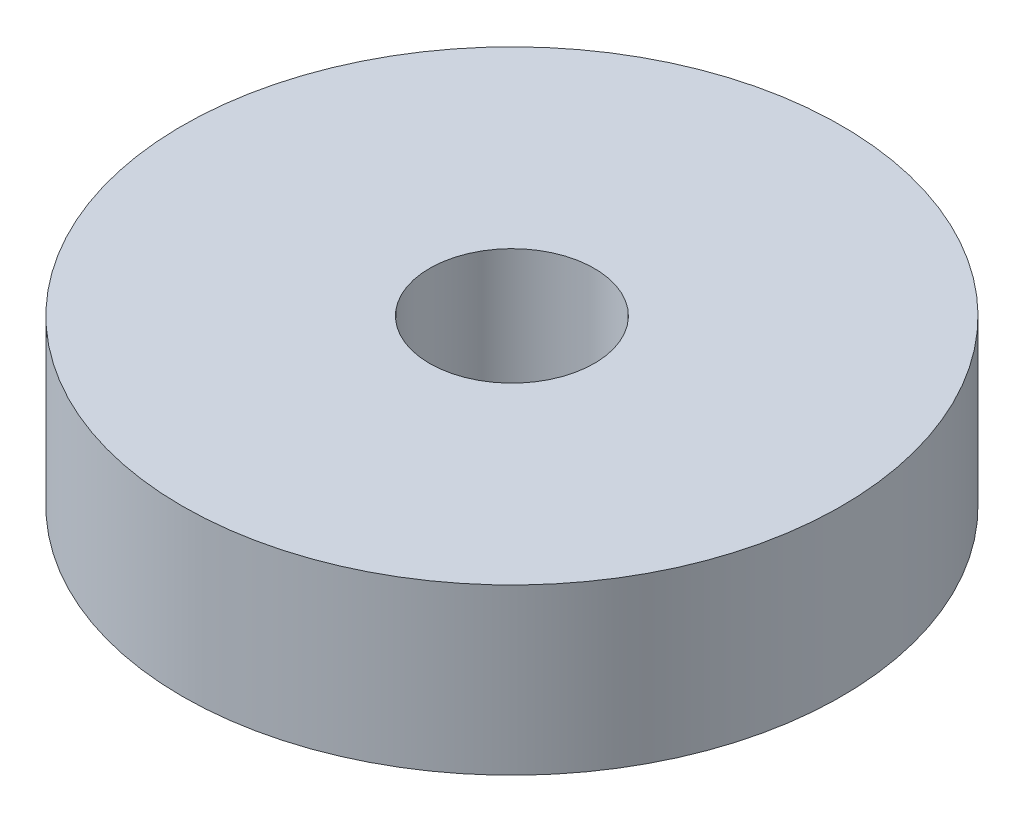
ISO-10303-21;
HEADER;
FILE_DESCRIPTION(('STEP AP214'),'2;1');
FILE_NAME('part.step','',(''),(''),'','','');
FILE_SCHEMA(('AUTOMOTIVE_DESIGN { 1 0 10303 214 1 1 1 1 }'));
ENDSEC;
DATA;
#1=APPLICATION_CONTEXT('core data for automotive mechanical design processes');
#2=APPLICATION_PROTOCOL_DEFINITION('international standard','automotive_design',2000,#1);
#3=PRODUCT_CONTEXT('',#1,'mechanical');
#4=PRODUCT('Part','Part','',(#3));
#5=PRODUCT_RELATED_PRODUCT_CATEGORY('part','',(#4));
#6=PRODUCT_DEFINITION_FORMATION('','',#4);
#7=PRODUCT_DEFINITION_CONTEXT('part definition',#1,'design');
#8=PRODUCT_DEFINITION('design','',#6,#7);
#9=PRODUCT_DEFINITION_SHAPE('','',#8);
#10=(LENGTH_UNIT() NAMED_UNIT(*) SI_UNIT(.MILLI.,.METRE.));
#11=(NAMED_UNIT(*) PLANE_ANGLE_UNIT() SI_UNIT($,.RADIAN.));
#12=(NAMED_UNIT(*) SI_UNIT($,.STERADIAN.) SOLID_ANGLE_UNIT());
#13=UNCERTAINTY_MEASURE_WITH_UNIT(LENGTH_MEASURE(1.E-05),#10,'distance_accuracy_value','');
#14=(GEOMETRIC_REPRESENTATION_CONTEXT(3) GLOBAL_UNCERTAINTY_ASSIGNED_CONTEXT((#13)) GLOBAL_UNIT_ASSIGNED_CONTEXT((#10,
#11,#12)) REPRESENTATION_CONTEXT('',''));
#15=CARTESIAN_POINT('',(0.,0.,0.));
#16=DIRECTION('',(0.,0.,1.));
#17=DIRECTION('',(1.,0.,0.));
#18=AXIS2_PLACEMENT_3D('',#15,#16,#17);
#19=CARTESIAN_POINT('',(0.,7.5,0.));
#20=DIRECTION('',(0.,1.,0.));
#21=DIRECTION('',(0.,0.,1.));
#22=AXIS2_PLACEMENT_3D('',#19,#20,#21);
#23=PLANE('',#22);
#24=CARTESIAN_POINT('',(0.,7.5,0.));
#25=DIRECTION('',(0.,1.,0.));
#26=DIRECTION('',(0.,0.,1.));
#27=AXIS2_PLACEMENT_3D('',#24,#25,#26);
#28=CIRCLE('',#27,30.);
#29=CARTESIAN_POINT('',(0.,7.5,30.));
#30=VERTEX_POINT('',#29);
#31=EDGE_CURVE('E10',#30,#30,#28,.T.);
#32=ORIENTED_EDGE('',*,*,#31,.T.);
#33=EDGE_LOOP('',(#32));
#34=FACE_BOUND('',#33,.T.);
#35=CARTESIAN_POINT('',(0.,7.5,0.));
#36=DIRECTION('',(0.,1.,0.));
#37=DIRECTION('',(0.,0.,1.));
#38=AXIS2_PLACEMENT_3D('',#35,#36,#37);
#39=CIRCLE('',#38,7.5);
#40=CARTESIAN_POINT('',(0.,7.5,7.5));
#41=VERTEX_POINT('',#40);
#42=EDGE_CURVE('E42',#41,#41,#39,.T.);
#43=ORIENTED_EDGE('',*,*,#42,.F.);
#44=EDGE_LOOP('',(#43));
#45=FACE_BOUND('',#44,.T.);
#46=ADVANCED_FACE('F31',(#34,#45),#23,.T.);
#47=CARTESIAN_POINT('',(0.,-7.5,0.));
#48=DIRECTION('',(0.,1.,0.));
#49=DIRECTION('',(0.,0.,1.));
#50=AXIS2_PLACEMENT_3D('',#47,#48,#49);
#51=PLANE('',#50);
#52=CARTESIAN_POINT('',(0.,-7.5,0.));
#53=DIRECTION('',(0.,1.,0.));
#54=DIRECTION('',(0.,0.,1.));
#55=AXIS2_PLACEMENT_3D('',#52,#53,#54);
#56=CIRCLE('',#55,30.);
#57=CARTESIAN_POINT('',(0.,-7.5,30.));
#58=VERTEX_POINT('',#57);
#59=EDGE_CURVE('E35',#58,#58,#56,.T.);
#60=ORIENTED_EDGE('',*,*,#59,.F.);
#61=EDGE_LOOP('',(#60));
#62=FACE_BOUND('',#61,.T.);
#63=CARTESIAN_POINT('',(0.,-7.5,0.));
#64=DIRECTION('',(0.,1.,0.));
#65=DIRECTION('',(0.,0.,1.));
#66=AXIS2_PLACEMENT_3D('',#63,#64,#65);
#67=CIRCLE('',#66,7.5);
#68=CARTESIAN_POINT('',(0.,-7.5,7.5));
#69=VERTEX_POINT('',#68);
#70=EDGE_CURVE('E44',#69,#69,#67,.T.);
#71=ORIENTED_EDGE('',*,*,#70,.T.);
#72=EDGE_LOOP('',(#71));
#73=FACE_BOUND('',#72,.T.);
#74=ADVANCED_FACE('F54',(#62,#73),#51,.F.);
#75=CARTESIAN_POINT('',(0.,7.5,0.));
#76=DIRECTION('',(0.,-1.,0.));
#77=DIRECTION('',(0.,0.,-1.));
#78=AXIS2_PLACEMENT_3D('',#75,#76,#77);
#79=CYLINDRICAL_SURFACE('',#78,30.);
#80=ORIENTED_EDGE('',*,*,#31,.F.);
#81=EDGE_LOOP('',(#80));
#82=FACE_BOUND('',#81,.T.);
#83=ORIENTED_EDGE('',*,*,#59,.T.);
#84=EDGE_LOOP('',(#83));
#85=FACE_BOUND('',#84,.T.);
#86=ADVANCED_FACE('F33',(#82,#85),#79,.T.);
#87=CARTESIAN_POINT('',(0.,7.5,0.));
#88=DIRECTION('',(0.,-1.,0.));
#89=DIRECTION('',(0.,0.,-1.));
#90=AXIS2_PLACEMENT_3D('',#87,#88,#89);
#91=CYLINDRICAL_SURFACE('',#90,7.5);
#92=ORIENTED_EDGE('',*,*,#42,.T.);
#93=EDGE_LOOP('',(#92));
#94=FACE_BOUND('',#93,.T.);
#95=ORIENTED_EDGE('',*,*,#70,.F.);
#96=EDGE_LOOP('',(#95));
#97=FACE_BOUND('',#96,.T.);
#98=ADVANCED_FACE('F50',(#94,#97),#91,.F.);
#99=CLOSED_SHELL('',(#46,#74,#86,#98));
#100=MANIFOLD_SOLID_BREP('B2',#99);
#101=ADVANCED_BREP_SHAPE_REPRESENTATION('',(#18,#100),#14);
#102=SHAPE_DEFINITION_REPRESENTATION(#9,#101);
ENDSEC;
END-ISO-10303-21;
